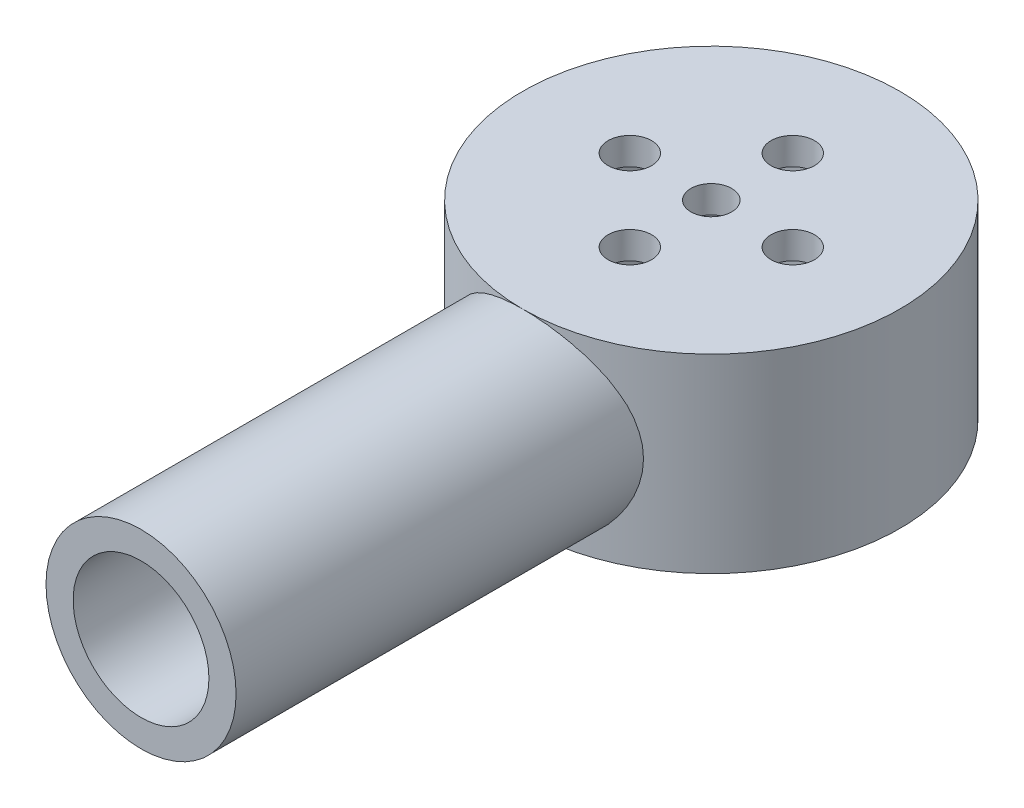
ISO-10303-21;
HEADER;
FILE_DESCRIPTION(('STEP AP214'),'2;1');
FILE_NAME('part.step','',(''),(''),'','','');
FILE_SCHEMA(('AUTOMOTIVE_DESIGN { 1 0 10303 214 1 1 1 1 }'));
ENDSEC;
DATA;
#1=APPLICATION_CONTEXT('core data for automotive mechanical design processes');
#2=APPLICATION_PROTOCOL_DEFINITION('international standard','automotive_design',2000,#1);
#3=PRODUCT_CONTEXT('',#1,'mechanical');
#4=PRODUCT('Part','Part','',(#3));
#5=PRODUCT_RELATED_PRODUCT_CATEGORY('part','',(#4));
#6=PRODUCT_DEFINITION_FORMATION('','',#4);
#7=PRODUCT_DEFINITION_CONTEXT('part definition',#1,'design');
#8=PRODUCT_DEFINITION('design','',#6,#7);
#9=PRODUCT_DEFINITION_SHAPE('','',#8);
#10=(LENGTH_UNIT() NAMED_UNIT(*) SI_UNIT(.MILLI.,.METRE.));
#11=(NAMED_UNIT(*) PLANE_ANGLE_UNIT() SI_UNIT($,.RADIAN.));
#12=(NAMED_UNIT(*) SI_UNIT($,.STERADIAN.) SOLID_ANGLE_UNIT());
#13=UNCERTAINTY_MEASURE_WITH_UNIT(LENGTH_MEASURE(1.E-05),#10,'distance_accuracy_value','');
#14=(GEOMETRIC_REPRESENTATION_CONTEXT(3) GLOBAL_UNCERTAINTY_ASSIGNED_CONTEXT((#13)) GLOBAL_UNIT_ASSIGNED_CONTEXT((#10,
#11,#12)) REPRESENTATION_CONTEXT('',''));
#15=CARTESIAN_POINT('',(0.,0.,0.));
#16=DIRECTION('',(0.,0.,1.));
#17=DIRECTION('',(1.,0.,0.));
#18=AXIS2_PLACEMENT_3D('',#15,#16,#17);
#19=CARTESIAN_POINT('',(0.,-7.,-48.));
#20=DIRECTION('',(0.,1.,0.));
#21=DIRECTION('',(0.,0.,1.));
#22=AXIS2_PLACEMENT_3D('',#19,#20,#21);
#23=CYLINDRICAL_SURFACE('',#22,1.6);
#24=CARTESIAN_POINT('',(0.,7.,-48.));
#25=DIRECTION('',(0.,1.,0.));
#26=DIRECTION('',(0.,0.,1.));
#27=AXIS2_PLACEMENT_3D('',#24,#25,#26);
#28=CIRCLE('',#27,1.6);
#29=CARTESIAN_POINT('',(0.,7.,-46.4));
#30=VERTEX_POINT('',#29);
#31=EDGE_CURVE('E65',#30,#30,#28,.T.);
#32=ORIENTED_EDGE('',*,*,#31,.T.);
#33=EDGE_LOOP('',(#32));
#34=FACE_BOUND('',#33,.T.);
#35=CARTESIAN_POINT('',(0.,5.,-48.));
#36=DIRECTION('',(0.,-1.,0.));
#37=DIRECTION('',(0.,0.,-1.));
#38=AXIS2_PLACEMENT_3D('',#35,#36,#37);
#39=CIRCLE('',#38,1.6);
#40=CARTESIAN_POINT('',(0.,5.,-49.6));
#41=VERTEX_POINT('',#40);
#42=EDGE_CURVE('E70',#41,#41,#39,.F.);
#43=ORIENTED_EDGE('',*,*,#42,.F.);
#44=EDGE_LOOP('',(#43));
#45=FACE_BOUND('',#44,.T.);
#46=ADVANCED_FACE('F51',(#34,#45),#23,.F.);
#47=CARTESIAN_POINT('',(6.,-7.,-42.));
#48=DIRECTION('',(0.,1.,0.));
#49=DIRECTION('',(0.,0.,1.));
#50=AXIS2_PLACEMENT_3D('',#47,#48,#49);
#51=CYLINDRICAL_SURFACE('',#50,1.6);
#52=CARTESIAN_POINT('',(6.,7.,-42.));
#53=DIRECTION('',(0.,1.,0.));
#54=DIRECTION('',(0.,0.,1.));
#55=AXIS2_PLACEMENT_3D('',#52,#53,#54);
#56=CIRCLE('',#55,1.6);
#57=CARTESIAN_POINT('',(6.,7.,-40.4));
#58=VERTEX_POINT('',#57);
#59=EDGE_CURVE('E77',#58,#58,#56,.T.);
#60=ORIENTED_EDGE('',*,*,#59,.T.);
#61=EDGE_LOOP('',(#60));
#62=FACE_BOUND('',#61,.T.);
#63=CARTESIAN_POINT('',(6.,5.,-42.));
#64=DIRECTION('',(0.,-1.,0.));
#65=DIRECTION('',(0.,0.,-1.));
#66=AXIS2_PLACEMENT_3D('',#63,#64,#65);
#67=CIRCLE('',#66,1.6);
#68=CARTESIAN_POINT('',(6.,5.,-43.6));
#69=VERTEX_POINT('',#68);
#70=EDGE_CURVE('E133',#69,#69,#67,.F.);
#71=ORIENTED_EDGE('',*,*,#70,.F.);
#72=EDGE_LOOP('',(#71));
#73=FACE_BOUND('',#72,.T.);
#74=ADVANCED_FACE('F107',(#62,#73),#51,.F.);
#75=CARTESIAN_POINT('',(-6.,-7.,-42.));
#76=DIRECTION('',(0.,1.,0.));
#77=DIRECTION('',(0.,0.,1.));
#78=AXIS2_PLACEMENT_3D('',#75,#76,#77);
#79=CYLINDRICAL_SURFACE('',#78,1.6);
#80=CARTESIAN_POINT('',(-6.,7.,-42.));
#81=DIRECTION('',(0.,1.,0.));
#82=DIRECTION('',(0.,0.,1.));
#83=AXIS2_PLACEMENT_3D('',#80,#81,#82);
#84=CIRCLE('',#83,1.6);
#85=CARTESIAN_POINT('',(-6.,7.,-40.4));
#86=VERTEX_POINT('',#85);
#87=EDGE_CURVE('E73',#86,#86,#84,.T.);
#88=ORIENTED_EDGE('',*,*,#87,.T.);
#89=EDGE_LOOP('',(#88));
#90=FACE_BOUND('',#89,.T.);
#91=CARTESIAN_POINT('',(-6.,5.,-42.));
#92=DIRECTION('',(0.,-1.,0.));
#93=DIRECTION('',(0.,0.,-1.));
#94=AXIS2_PLACEMENT_3D('',#91,#92,#93);
#95=CIRCLE('',#94,1.6);
#96=CARTESIAN_POINT('',(-6.,5.,-43.6));
#97=VERTEX_POINT('',#96);
#98=EDGE_CURVE('E126',#97,#97,#95,.F.);
#99=ORIENTED_EDGE('',*,*,#98,.F.);
#100=EDGE_LOOP('',(#99));
#101=FACE_BOUND('',#100,.T.);
#102=ADVANCED_FACE('F115',(#90,#101),#79,.F.);
#103=CARTESIAN_POINT('',(0.,-7.,-36.));
#104=DIRECTION('',(0.,1.,0.));
#105=DIRECTION('',(0.,0.,1.));
#106=AXIS2_PLACEMENT_3D('',#103,#104,#105);
#107=CYLINDRICAL_SURFACE('',#106,1.6);
#108=CARTESIAN_POINT('',(0.,7.,-36.));
#109=DIRECTION('',(0.,1.,0.));
#110=DIRECTION('',(0.,0.,1.));
#111=AXIS2_PLACEMENT_3D('',#108,#109,#110);
#112=CIRCLE('',#111,1.6);
#113=CARTESIAN_POINT('',(0.,7.,-34.4));
#114=VERTEX_POINT('',#113);
#115=EDGE_CURVE('E75',#114,#114,#112,.T.);
#116=ORIENTED_EDGE('',*,*,#115,.T.);
#117=EDGE_LOOP('',(#116));
#118=FACE_BOUND('',#117,.T.);
#119=CARTESIAN_POINT('',(0.,5.,-36.));
#120=DIRECTION('',(0.,-1.,0.));
#121=DIRECTION('',(0.,0.,-1.));
#122=AXIS2_PLACEMENT_3D('',#119,#120,#121);
#123=CIRCLE('',#122,1.6);
#124=CARTESIAN_POINT('',(0.,5.,-37.6));
#125=VERTEX_POINT('',#124);
#126=EDGE_CURVE('E127',#125,#125,#123,.F.);
#127=ORIENTED_EDGE('',*,*,#126,.F.);
#128=EDGE_LOOP('',(#127));
#129=FACE_BOUND('',#128,.T.);
#130=ADVANCED_FACE('F102',(#118,#129),#107,.F.);
#131=CARTESIAN_POINT('',(0.,-7.,-42.));
#132=DIRECTION('',(0.,1.,0.));
#133=DIRECTION('',(0.,0.,1.));
#134=AXIS2_PLACEMENT_3D('',#131,#132,#133);
#135=CYLINDRICAL_SURFACE('',#134,1.5);
#136=CARTESIAN_POINT('',(0.,7.,-42.));
#137=DIRECTION('',(0.,1.,0.));
#138=DIRECTION('',(0.,0.,1.));
#139=AXIS2_PLACEMENT_3D('',#136,#137,#138);
#140=CIRCLE('',#139,1.5);
#141=CARTESIAN_POINT('',(0.,7.,-40.5));
#142=VERTEX_POINT('',#141);
#143=EDGE_CURVE('E67',#142,#142,#140,.T.);
#144=ORIENTED_EDGE('',*,*,#143,.T.);
#145=EDGE_LOOP('',(#144));
#146=FACE_BOUND('',#145,.T.);
#147=CARTESIAN_POINT('',(0.,5.,-42.));
#148=DIRECTION('',(0.,-1.,0.));
#149=DIRECTION('',(0.,0.,-1.));
#150=AXIS2_PLACEMENT_3D('',#147,#148,#149);
#151=CIRCLE('',#150,1.5);
#152=CARTESIAN_POINT('',(0.,5.,-43.5));
#153=VERTEX_POINT('',#152);
#154=EDGE_CURVE('E54',#153,#153,#151,.F.);
#155=ORIENTED_EDGE('',*,*,#154,.F.);
#156=EDGE_LOOP('',(#155));
#157=FACE_BOUND('',#156,.T.);
#158=ADVANCED_FACE('F52',(#146,#157),#135,.F.);
#159=CARTESIAN_POINT('',(0.,-7.,-42.));
#160=DIRECTION('',(0.,1.,0.));
#161=DIRECTION('',(0.,0.,1.));
#162=AXIS2_PLACEMENT_3D('',#159,#160,#161);
#163=CYLINDRICAL_SURFACE('',#162,13.8924439894498);
#164=CARTESIAN_POINT('',(0.,-7.,-42.));
#165=DIRECTION('',(0.,1.,0.));
#166=DIRECTION('',(0.,0.,1.));
#167=AXIS2_PLACEMENT_3D('',#164,#165,#166);
#168=CIRCLE('',#167,13.8924439894498);
#169=CARTESIAN_POINT('',(0.,-7.,-28.1075560105502));
#170=VERTEX_POINT('',#169);
#171=EDGE_CURVE('E11',#170,#170,#168,.T.);
#172=ORIENTED_EDGE('',*,*,#171,.T.);
#173=EDGE_LOOP('',(#172));
#174=FACE_BOUND('',#173,.T.);
#175=CARTESIAN_POINT('',(0.,7.,-42.));
#176=DIRECTION('',(0.,1.,0.));
#177=DIRECTION('',(0.,0.,1.));
#178=AXIS2_PLACEMENT_3D('',#175,#176,#177);
#179=CIRCLE('',#178,13.8924439894498);
#180=CARTESIAN_POINT('',(0.,7.,-28.1075560105502));
#181=VERTEX_POINT('',#180);
#182=EDGE_CURVE('E56',#181,#181,#179,.T.);
#183=ORIENTED_EDGE('',*,*,#182,.F.);
#184=EDGE_LOOP('',(#183));
#185=FACE_BOUND('',#184,.T.);
#186=ADVANCED_FACE('F92',(#174,#185),#163,.T.);
#187=CARTESIAN_POINT('',(0.,-7.,0.));
#188=DIRECTION('',(0.,1.,0.));
#189=DIRECTION('',(0.,0.,1.));
#190=AXIS2_PLACEMENT_3D('',#187,#188,#189);
#191=PLANE('',#190);
#192=CARTESIAN_POINT('',(0.,-7.,-42.));
#193=DIRECTION('',(0.,-1.,0.));
#194=DIRECTION('',(0.,0.,-1.));
#195=AXIS2_PLACEMENT_3D('',#192,#193,#194);
#196=CIRCLE('',#195,11.8924439894498);
#197=CARTESIAN_POINT('',(0.,-7.,-53.8924439894498));
#198=VERTEX_POINT('',#197);
#199=EDGE_CURVE('E136',#198,#198,#196,.T.);
#200=ORIENTED_EDGE('',*,*,#199,.F.);
#201=EDGE_LOOP('',(#200));
#202=FACE_BOUND('',#201,.T.);
#203=ORIENTED_EDGE('',*,*,#171,.F.);
#204=EDGE_LOOP('',(#203));
#205=FACE_BOUND('',#204,.T.);
#206=ADVANCED_FACE('F89',(#202,#205),#191,.F.);
#207=CARTESIAN_POINT('',(0.,7.,0.));
#208=DIRECTION('',(0.,1.,0.));
#209=DIRECTION('',(0.,0.,1.));
#210=AXIS2_PLACEMENT_3D('',#207,#208,#209);
#211=PLANE('',#210);
#212=ORIENTED_EDGE('',*,*,#143,.F.);
#213=EDGE_LOOP('',(#212));
#214=FACE_BOUND('',#213,.T.);
#215=ORIENTED_EDGE('',*,*,#115,.F.);
#216=EDGE_LOOP('',(#215));
#217=FACE_BOUND('',#216,.T.);
#218=ORIENTED_EDGE('',*,*,#87,.F.);
#219=EDGE_LOOP('',(#218));
#220=FACE_BOUND('',#219,.T.);
#221=ORIENTED_EDGE('',*,*,#59,.F.);
#222=EDGE_LOOP('',(#221));
#223=FACE_BOUND('',#222,.T.);
#224=ORIENTED_EDGE('',*,*,#31,.F.);
#225=EDGE_LOOP('',(#224));
#226=FACE_BOUND('',#225,.T.);
#227=ORIENTED_EDGE('',*,*,#182,.T.);
#228=EDGE_LOOP('',(#227));
#229=FACE_BOUND('',#228,.T.);
#230=ADVANCED_FACE('F88',(#214,#217,#220,#223,#226,#229),#211,.T.);
#231=CARTESIAN_POINT('',(0.,5.,-42.));
#232=DIRECTION('',(0.,-1.,0.));
#233=DIRECTION('',(0.,0.,-1.));
#234=AXIS2_PLACEMENT_3D('',#231,#232,#233);
#235=PLANE('',#234);
#236=CARTESIAN_POINT('',(0.,5.,-42.));
#237=DIRECTION('',(0.,-1.,0.));
#238=DIRECTION('',(0.,0.,-1.));
#239=AXIS2_PLACEMENT_3D('',#236,#237,#238);
#240=CIRCLE('',#239,11.8924439894498);
#241=CARTESIAN_POINT('',(0.,5.,-53.8924439894498));
#242=VERTEX_POINT('',#241);
#243=EDGE_CURVE('E135',#242,#242,#240,.T.);
#244=ORIENTED_EDGE('',*,*,#243,.T.);
#245=EDGE_LOOP('',(#244));
#246=FACE_BOUND('',#245,.T.);
#247=ORIENTED_EDGE('',*,*,#154,.T.);
#248=EDGE_LOOP('',(#247));
#249=FACE_BOUND('',#248,.T.);
#250=ORIENTED_EDGE('',*,*,#126,.T.);
#251=EDGE_LOOP('',(#250));
#252=FACE_BOUND('',#251,.T.);
#253=ORIENTED_EDGE('',*,*,#98,.T.);
#254=EDGE_LOOP('',(#253));
#255=FACE_BOUND('',#254,.T.);
#256=ORIENTED_EDGE('',*,*,#70,.T.);
#257=EDGE_LOOP('',(#256));
#258=FACE_BOUND('',#257,.T.);
#259=ORIENTED_EDGE('',*,*,#42,.T.);
#260=EDGE_LOOP('',(#259));
#261=FACE_BOUND('',#260,.T.);
#262=ADVANCED_FACE('F90',(#246,#249,#252,#255,#258,#261),#235,.T.);
#263=CARTESIAN_POINT('',(0.,5.,-42.));
#264=DIRECTION('',(0.,-1.,0.));
#265=DIRECTION('',(0.,0.,-1.));
#266=AXIS2_PLACEMENT_3D('',#263,#264,#265);
#267=CYLINDRICAL_SURFACE('',#266,11.8924439894498);
#268=ORIENTED_EDGE('',*,*,#243,.F.);
#269=EDGE_LOOP('',(#268));
#270=FACE_BOUND('',#269,.T.);
#271=ORIENTED_EDGE('',*,*,#199,.T.);
#272=EDGE_LOOP('',(#271));
#273=FACE_BOUND('',#272,.T.);
#274=ADVANCED_FACE('F144',(#270,#273),#267,.F.);
#275=CLOSED_SHELL('',(#46,#74,#102,#130,#158,#186,#206,#230,#262,#274));
#276=MANIFOLD_SOLID_BREP('B2',#275);
#277=CARTESIAN_POINT('',(0.,0.,-30.));
#278=DIRECTION('',(0.,0.,1.));
#279=DIRECTION('',(1.,0.,0.));
#280=AXIS2_PLACEMENT_3D('',#277,#278,#279);
#281=CYLINDRICAL_SURFACE('',#280,5.);
#282=CARTESIAN_POINT('',(0.,0.,-30.));
#283=DIRECTION('',(0.,0.,1.));
#284=DIRECTION('',(1.,0.,0.));
#285=AXIS2_PLACEMENT_3D('',#282,#283,#284);
#286=CIRCLE('',#285,5.);
#287=CARTESIAN_POINT('',(5.,0.,-30.));
#288=VERTEX_POINT('',#287);
#289=EDGE_CURVE('E232',#288,#288,#286,.T.);
#290=ORIENTED_EDGE('',*,*,#289,.F.);
#291=EDGE_LOOP('',(#290));
#292=FACE_BOUND('',#291,.T.);
#293=CARTESIAN_POINT('',(0.,0.,0.));
#294=DIRECTION('',(0.,0.,1.));
#295=DIRECTION('',(1.,0.,0.));
#296=AXIS2_PLACEMENT_3D('',#293,#294,#295);
#297=CIRCLE('',#296,5.);
#298=CARTESIAN_POINT('',(5.,0.,0.));
#299=VERTEX_POINT('',#298);
#300=EDGE_CURVE('E238',#299,#299,#297,.T.);
#301=ORIENTED_EDGE('',*,*,#300,.T.);
#302=EDGE_LOOP('',(#301));
#303=FACE_BOUND('',#302,.T.);
#304=ADVANCED_FACE('F229',(#292,#303),#281,.F.);
#305=CARTESIAN_POINT('',(0.,0.,-30.));
#306=DIRECTION('',(0.,0.,1.));
#307=DIRECTION('',(1.,0.,0.));
#308=AXIS2_PLACEMENT_3D('',#305,#306,#307);
#309=CYLINDRICAL_SURFACE('',#308,7.);
#310=CARTESIAN_POINT('',(0.,0.,-30.));
#311=DIRECTION('',(0.,0.,1.));
#312=DIRECTION('',(1.,0.,0.));
#313=AXIS2_PLACEMENT_3D('',#310,#311,#312);
#314=CIRCLE('',#313,7.);
#315=CARTESIAN_POINT('',(7.,0.,-30.));
#316=VERTEX_POINT('',#315);
#317=EDGE_CURVE('E49',#316,#316,#314,.T.);
#318=ORIENTED_EDGE('',*,*,#317,.T.);
#319=EDGE_LOOP('',(#318));
#320=FACE_BOUND('',#319,.T.);
#321=CARTESIAN_POINT('',(0.,0.,0.));
#322=DIRECTION('',(0.,0.,1.));
#323=DIRECTION('',(1.,0.,0.));
#324=AXIS2_PLACEMENT_3D('',#321,#322,#323);
#325=CIRCLE('',#324,7.);
#326=CARTESIAN_POINT('',(7.,0.,0.));
#327=VERTEX_POINT('',#326);
#328=EDGE_CURVE('E226',#327,#327,#325,.T.);
#329=ORIENTED_EDGE('',*,*,#328,.F.);
#330=EDGE_LOOP('',(#329));
#331=FACE_BOUND('',#330,.T.);
#332=ADVANCED_FACE('F247',(#320,#331),#309,.T.);
#333=CARTESIAN_POINT('',(0.,0.,-30.));
#334=DIRECTION('',(0.,0.,1.));
#335=DIRECTION('',(1.,0.,0.));
#336=AXIS2_PLACEMENT_3D('',#333,#334,#335);
#337=PLANE('',#336);
#338=ORIENTED_EDGE('',*,*,#289,.T.);
#339=EDGE_LOOP('',(#338));
#340=FACE_BOUND('',#339,.T.);
#341=ORIENTED_EDGE('',*,*,#317,.F.);
#342=EDGE_LOOP('',(#341));
#343=FACE_BOUND('',#342,.T.);
#344=ADVANCED_FACE('F253',(#340,#343),#337,.F.);
#345=CARTESIAN_POINT('',(0.,0.,0.));
#346=DIRECTION('',(0.,0.,1.));
#347=DIRECTION('',(1.,0.,0.));
#348=AXIS2_PLACEMENT_3D('',#345,#346,#347);
#349=PLANE('',#348);
#350=ORIENTED_EDGE('',*,*,#300,.F.);
#351=EDGE_LOOP('',(#350));
#352=FACE_BOUND('',#351,.T.);
#353=ORIENTED_EDGE('',*,*,#328,.T.);
#354=EDGE_LOOP('',(#353));
#355=FACE_BOUND('',#354,.T.);
#356=ADVANCED_FACE('F250',(#352,#355),#349,.T.);
#357=CLOSED_SHELL('',(#304,#332,#344,#356));
#358=MANIFOLD_SOLID_BREP('B6',#357);
#359=ADVANCED_BREP_SHAPE_REPRESENTATION('',(#18,#276,#358),#14);
#360=SHAPE_DEFINITION_REPRESENTATION(#9,#359);
ENDSEC;
END-ISO-10303-21;
